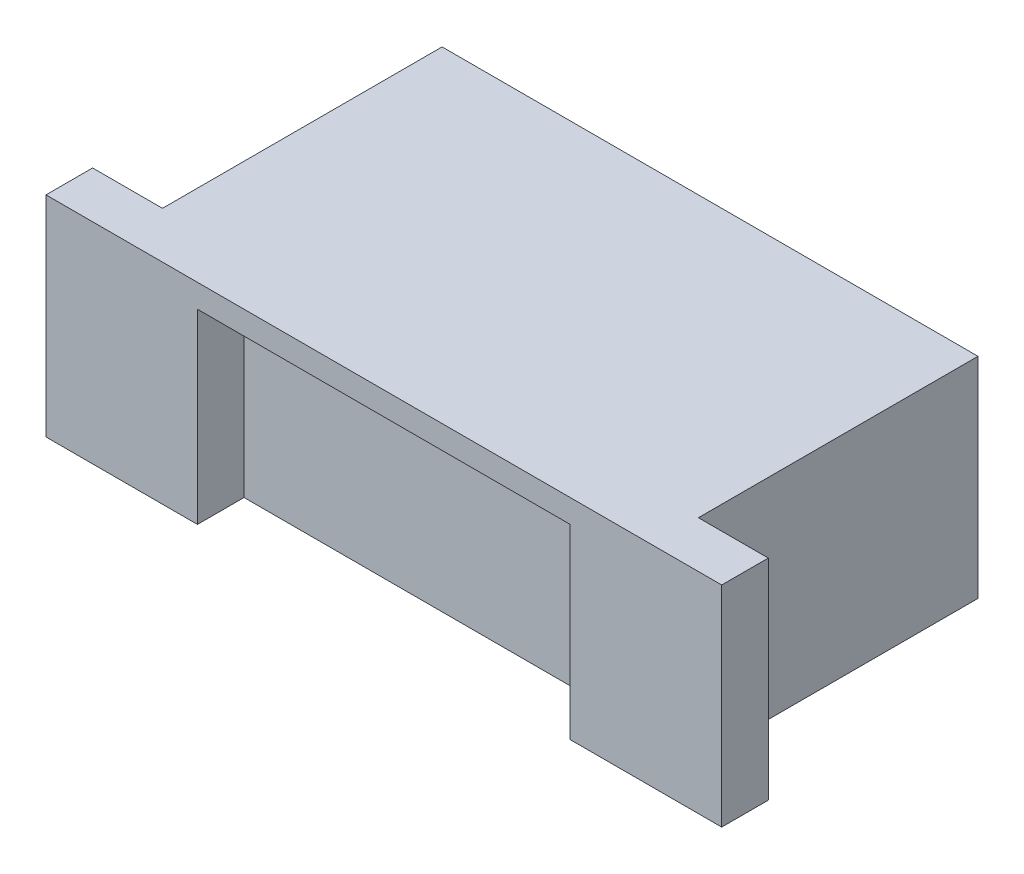
ISO-10303-21;
HEADER;
FILE_DESCRIPTION(('STEP AP214'),'2;1');
FILE_NAME('part.step','',(''),(''),'','','');
FILE_SCHEMA(('AUTOMOTIVE_DESIGN { 1 0 10303 214 1 1 1 1 }'));
ENDSEC;
DATA;
#1=APPLICATION_CONTEXT('core data for automotive mechanical design processes');
#2=APPLICATION_PROTOCOL_DEFINITION('international standard','automotive_design',2000,#1);
#3=PRODUCT_CONTEXT('',#1,'mechanical');
#4=PRODUCT('Part','Part','',(#3));
#5=PRODUCT_RELATED_PRODUCT_CATEGORY('part','',(#4));
#6=PRODUCT_DEFINITION_FORMATION('','',#4);
#7=PRODUCT_DEFINITION_CONTEXT('part definition',#1,'design');
#8=PRODUCT_DEFINITION('design','',#6,#7);
#9=PRODUCT_DEFINITION_SHAPE('','',#8);
#10=(LENGTH_UNIT() NAMED_UNIT(*) SI_UNIT(.MILLI.,.METRE.));
#11=(NAMED_UNIT(*) PLANE_ANGLE_UNIT() SI_UNIT($,.RADIAN.));
#12=(NAMED_UNIT(*) SI_UNIT($,.STERADIAN.) SOLID_ANGLE_UNIT());
#13=UNCERTAINTY_MEASURE_WITH_UNIT(LENGTH_MEASURE(1.E-05),#10,'distance_accuracy_value','');
#14=(GEOMETRIC_REPRESENTATION_CONTEXT(3) GLOBAL_UNCERTAINTY_ASSIGNED_CONTEXT((#13)) GLOBAL_UNIT_ASSIGNED_CONTEXT((#10,
#11,#12)) REPRESENTATION_CONTEXT('',''));
#15=CARTESIAN_POINT('',(0.,0.,0.));
#16=DIRECTION('',(0.,0.,1.));
#17=DIRECTION('',(1.,0.,0.));
#18=AXIS2_PLACEMENT_3D('',#15,#16,#17);
#19=CARTESIAN_POINT('',(0.,2.25,-0.5));
#20=DIRECTION('',(1.,0.,0.));
#21=DIRECTION('',(0.,0.,-1.));
#22=AXIS2_PLACEMENT_3D('',#19,#20,#21);
#23=PLANE('',#22);
#24=DIRECTION('',(0.,0.,1.));
#25=VECTOR('',#24,1.);
#26=CARTESIAN_POINT('',(0.,0.,-0.5));
#27=LINE('',#26,#25);
#28=CARTESIAN_POINT('',(0.,0.,-0.5));
#29=VERTEX_POINT('',#28);
#30=CARTESIAN_POINT('',(0.,0.,0.));
#31=VERTEX_POINT('',#30);
#32=EDGE_CURVE('E152',#29,#31,#27,.T.);
#33=ORIENTED_EDGE('',*,*,#32,.T.);
#34=DIRECTION('',(0.,-1.,0.));
#35=VECTOR('',#34,1.);
#36=CARTESIAN_POINT('',(0.,2.25,0.));
#37=LINE('',#36,#35);
#38=CARTESIAN_POINT('',(0.,2.25,0.));
#39=VERTEX_POINT('',#38);
#40=EDGE_CURVE('E11',#39,#31,#37,.T.);
#41=ORIENTED_EDGE('',*,*,#40,.F.);
#42=DIRECTION('',(0.,0.,1.));
#43=VECTOR('',#42,1.);
#44=CARTESIAN_POINT('',(0.,2.25,-0.5));
#45=LINE('',#44,#43);
#46=CARTESIAN_POINT('',(0.,2.25,-0.5));
#47=VERTEX_POINT('',#46);
#48=EDGE_CURVE('E178',#47,#39,#45,.T.);
#49=ORIENTED_EDGE('',*,*,#48,.F.);
#50=DIRECTION('',(0.,-1.,0.));
#51=VECTOR('',#50,1.);
#52=CARTESIAN_POINT('',(0.,2.25,-0.5));
#53=LINE('',#52,#51);
#54=EDGE_CURVE('E148',#47,#29,#53,.T.);
#55=ORIENTED_EDGE('',*,*,#54,.T.);
#56=EDGE_LOOP('',(#33,#41,#49,#55));
#57=FACE_BOUND('',#56,.T.);
#58=ADVANCED_FACE('F39',(#57),#23,.F.);
#59=CARTESIAN_POINT('',(0.,2.25,0.));
#60=DIRECTION('',(0.,0.,-1.));
#61=DIRECTION('',(-1.,0.,0.));
#62=AXIS2_PLACEMENT_3D('',#59,#60,#61);
#63=PLANE('',#62);
#64=DIRECTION('',(1.,0.,0.));
#65=VECTOR('',#64,1.);
#66=CARTESIAN_POINT('',(0.,0.,0.));
#67=LINE('',#66,#65);
#68=CARTESIAN_POINT('',(1.625,0.,0.));
#69=VERTEX_POINT('',#68);
#70=EDGE_CURVE('E158',#31,#69,#67,.T.);
#71=ORIENTED_EDGE('',*,*,#70,.T.);
#72=DIRECTION('',(0.,-1.,0.));
#73=VECTOR('',#72,1.);
#74=CARTESIAN_POINT('',(1.625,0.,0.));
#75=LINE('',#74,#73);
#76=CARTESIAN_POINT('',(1.625,2.,0.));
#77=VERTEX_POINT('',#76);
#78=EDGE_CURVE('E249',#77,#69,#75,.T.);
#79=ORIENTED_EDGE('',*,*,#78,.F.);
#80=DIRECTION('',(-1.,0.,0.));
#81=VECTOR('',#80,1.);
#82=CARTESIAN_POINT('',(1.625,2.,0.));
#83=LINE('',#82,#81);
#84=CARTESIAN_POINT('',(5.625,2.,0.));
#85=VERTEX_POINT('',#84);
#86=EDGE_CURVE('E241',#85,#77,#83,.T.);
#87=ORIENTED_EDGE('',*,*,#86,.F.);
#88=DIRECTION('',(0.,1.,0.));
#89=VECTOR('',#88,1.);
#90=CARTESIAN_POINT('',(5.625,0.,0.));
#91=LINE('',#90,#89);
#92=CARTESIAN_POINT('',(5.625,0.,0.));
#93=VERTEX_POINT('',#92);
#94=EDGE_CURVE('E245',#93,#85,#91,.T.);
#95=ORIENTED_EDGE('',*,*,#94,.F.);
#96=CARTESIAN_POINT('',(7.25,0.,0.));
#97=VERTEX_POINT('',#96);
#98=EDGE_CURVE('E156',#93,#97,#67,.T.);
#99=ORIENTED_EDGE('',*,*,#98,.T.);
#100=DIRECTION('',(0.,-1.,0.));
#101=VECTOR('',#100,1.);
#102=CARTESIAN_POINT('',(7.25,2.25,0.));
#103=LINE('',#102,#101);
#104=CARTESIAN_POINT('',(7.25,2.25,0.));
#105=VERTEX_POINT('',#104);
#106=EDGE_CURVE('E47',#105,#97,#103,.T.);
#107=ORIENTED_EDGE('',*,*,#106,.F.);
#108=DIRECTION('',(1.,0.,0.));
#109=VECTOR('',#108,1.);
#110=CARTESIAN_POINT('',(0.,2.25,0.));
#111=LINE('',#110,#109);
#112=EDGE_CURVE('E104',#39,#105,#111,.T.);
#113=ORIENTED_EDGE('',*,*,#112,.F.);
#114=ORIENTED_EDGE('',*,*,#40,.T.);
#115=EDGE_LOOP('',(#71,#79,#87,#95,#99,#107,#113,#114));
#116=FACE_BOUND('',#115,.T.);
#117=ADVANCED_FACE('F265',(#116),#63,.F.);
#118=CARTESIAN_POINT('',(7.25,2.25,0.));
#119=DIRECTION('',(-1.,0.,0.));
#120=DIRECTION('',(0.,0.,1.));
#121=AXIS2_PLACEMENT_3D('',#118,#119,#120);
#122=PLANE('',#121);
#123=DIRECTION('',(0.,0.,-1.));
#124=VECTOR('',#123,1.);
#125=CARTESIAN_POINT('',(7.25,0.,0.));
#126=LINE('',#125,#124);
#127=CARTESIAN_POINT('',(7.25,0.,-0.500000000000001));
#128=VERTEX_POINT('',#127);
#129=EDGE_CURVE('E162',#97,#128,#126,.T.);
#130=ORIENTED_EDGE('',*,*,#129,.T.);
#131=DIRECTION('',(0.,-1.,0.));
#132=VECTOR('',#131,1.);
#133=CARTESIAN_POINT('',(7.25,2.25,-0.500000000000001));
#134=LINE('',#133,#132);
#135=CARTESIAN_POINT('',(7.25,2.25,-0.500000000000001));
#136=VERTEX_POINT('',#135);
#137=EDGE_CURVE('E189',#136,#128,#134,.T.);
#138=ORIENTED_EDGE('',*,*,#137,.F.);
#139=DIRECTION('',(0.,0.,-1.));
#140=VECTOR('',#139,1.);
#141=CARTESIAN_POINT('',(7.25,2.25,0.));
#142=LINE('',#141,#140);
#143=EDGE_CURVE('E199',#105,#136,#142,.T.);
#144=ORIENTED_EDGE('',*,*,#143,.F.);
#145=ORIENTED_EDGE('',*,*,#106,.T.);
#146=EDGE_LOOP('',(#130,#138,#144,#145));
#147=FACE_BOUND('',#146,.T.);
#148=ADVANCED_FACE('F197',(#147),#122,.F.);
#149=CARTESIAN_POINT('',(7.25,2.25,-0.500000000000001));
#150=DIRECTION('',(0.,0.,1.));
#151=DIRECTION('',(1.,0.,0.));
#152=AXIS2_PLACEMENT_3D('',#149,#150,#151);
#153=PLANE('',#152);
#154=DIRECTION('',(-1.,0.,0.));
#155=VECTOR('',#154,1.);
#156=CARTESIAN_POINT('',(7.25,0.,-0.500000000000001));
#157=LINE('',#156,#155);
#158=CARTESIAN_POINT('',(6.5,0.,-0.500000000000002));
#159=VERTEX_POINT('',#158);
#160=EDGE_CURVE('E165',#128,#159,#157,.T.);
#161=ORIENTED_EDGE('',*,*,#160,.T.);
#162=DIRECTION('',(0.,-1.,0.));
#163=VECTOR('',#162,1.);
#164=CARTESIAN_POINT('',(6.5,2.25,-0.500000000000002));
#165=LINE('',#164,#163);
#166=CARTESIAN_POINT('',(6.5,2.25,-0.500000000000002));
#167=VERTEX_POINT('',#166);
#168=EDGE_CURVE('E185',#167,#159,#165,.T.);
#169=ORIENTED_EDGE('',*,*,#168,.F.);
#170=DIRECTION('',(-1.,0.,0.));
#171=VECTOR('',#170,1.);
#172=CARTESIAN_POINT('',(7.25,2.25,-0.500000000000001));
#173=LINE('',#172,#171);
#174=EDGE_CURVE('E215',#136,#167,#173,.T.);
#175=ORIENTED_EDGE('',*,*,#174,.F.);
#176=ORIENTED_EDGE('',*,*,#137,.T.);
#177=EDGE_LOOP('',(#161,#169,#175,#176));
#178=FACE_BOUND('',#177,.T.);
#179=ADVANCED_FACE('F210',(#178),#153,.F.);
#180=CARTESIAN_POINT('',(6.5,2.25,-0.500000000000002));
#181=DIRECTION('',(-1.,0.,0.));
#182=DIRECTION('',(0.,0.,1.));
#183=AXIS2_PLACEMENT_3D('',#180,#181,#182);
#184=PLANE('',#183);
#185=DIRECTION('',(0.,0.,-1.));
#186=VECTOR('',#185,1.);
#187=CARTESIAN_POINT('',(6.5,0.,-0.500000000000002));
#188=LINE('',#187,#186);
#189=CARTESIAN_POINT('',(6.5,0.,-3.5));
#190=VERTEX_POINT('',#189);
#191=EDGE_CURVE('E168',#159,#190,#188,.T.);
#192=ORIENTED_EDGE('',*,*,#191,.T.);
#193=DIRECTION('',(0.,-1.,0.));
#194=VECTOR('',#193,1.);
#195=CARTESIAN_POINT('',(6.5,2.25,-3.5));
#196=LINE('',#195,#194);
#197=CARTESIAN_POINT('',(6.5,2.25,-3.5));
#198=VERTEX_POINT('',#197);
#199=EDGE_CURVE('E141',#198,#190,#196,.T.);
#200=ORIENTED_EDGE('',*,*,#199,.F.);
#201=DIRECTION('',(0.,0.,-1.));
#202=VECTOR('',#201,1.);
#203=CARTESIAN_POINT('',(6.5,2.25,-0.500000000000002));
#204=LINE('',#203,#202);
#205=EDGE_CURVE('E127',#167,#198,#204,.T.);
#206=ORIENTED_EDGE('',*,*,#205,.F.);
#207=ORIENTED_EDGE('',*,*,#168,.T.);
#208=EDGE_LOOP('',(#192,#200,#206,#207));
#209=FACE_BOUND('',#208,.T.);
#210=ADVANCED_FACE('F213',(#209),#184,.F.);
#211=CARTESIAN_POINT('',(6.5,2.25,-3.5));
#212=DIRECTION('',(0.,0.,1.));
#213=DIRECTION('',(1.,0.,0.));
#214=AXIS2_PLACEMENT_3D('',#211,#212,#213);
#215=PLANE('',#214);
#216=DIRECTION('',(-1.,0.,0.));
#217=VECTOR('',#216,1.);
#218=CARTESIAN_POINT('',(6.5,0.,-3.5));
#219=LINE('',#218,#217);
#220=CARTESIAN_POINT('',(0.75,0.,-3.5));
#221=VERTEX_POINT('',#220);
#222=EDGE_CURVE('E137',#190,#221,#219,.T.);
#223=ORIENTED_EDGE('',*,*,#222,.T.);
#224=DIRECTION('',(0.,-1.,0.));
#225=VECTOR('',#224,1.);
#226=CARTESIAN_POINT('',(0.75,2.25,-3.5));
#227=LINE('',#226,#225);
#228=CARTESIAN_POINT('',(0.75,2.25,-3.5));
#229=VERTEX_POINT('',#228);
#230=EDGE_CURVE('E134',#229,#221,#227,.T.);
#231=ORIENTED_EDGE('',*,*,#230,.F.);
#232=DIRECTION('',(-1.,0.,0.));
#233=VECTOR('',#232,1.);
#234=CARTESIAN_POINT('',(6.5,2.25,-3.5));
#235=LINE('',#234,#233);
#236=EDGE_CURVE('E120',#198,#229,#235,.T.);
#237=ORIENTED_EDGE('',*,*,#236,.F.);
#238=ORIENTED_EDGE('',*,*,#199,.T.);
#239=EDGE_LOOP('',(#223,#231,#237,#238));
#240=FACE_BOUND('',#239,.T.);
#241=ADVANCED_FACE('F135',(#240),#215,.F.);
#242=CARTESIAN_POINT('',(0.75,2.25,-3.5));
#243=DIRECTION('',(1.,0.,0.));
#244=DIRECTION('',(0.,0.,-1.));
#245=AXIS2_PLACEMENT_3D('',#242,#243,#244);
#246=PLANE('',#245);
#247=DIRECTION('',(0.,0.,1.));
#248=VECTOR('',#247,1.);
#249=CARTESIAN_POINT('',(0.75,0.,-3.5));
#250=LINE('',#249,#248);
#251=CARTESIAN_POINT('',(0.75,0.,-0.5));
#252=VERTEX_POINT('',#251);
#253=EDGE_CURVE('E173',#221,#252,#250,.T.);
#254=ORIENTED_EDGE('',*,*,#253,.T.);
#255=DIRECTION('',(0.,-1.,0.));
#256=VECTOR('',#255,1.);
#257=CARTESIAN_POINT('',(0.75,2.25,-0.5));
#258=LINE('',#257,#256);
#259=CARTESIAN_POINT('',(0.75,2.25,-0.5));
#260=VERTEX_POINT('',#259);
#261=EDGE_CURVE('E142',#260,#252,#258,.T.);
#262=ORIENTED_EDGE('',*,*,#261,.F.);
#263=DIRECTION('',(0.,0.,1.));
#264=VECTOR('',#263,1.);
#265=CARTESIAN_POINT('',(0.75,2.25,-3.5));
#266=LINE('',#265,#264);
#267=EDGE_CURVE('E124',#229,#260,#266,.T.);
#268=ORIENTED_EDGE('',*,*,#267,.F.);
#269=ORIENTED_EDGE('',*,*,#230,.T.);
#270=EDGE_LOOP('',(#254,#262,#268,#269));
#271=FACE_BOUND('',#270,.T.);
#272=ADVANCED_FACE('F144',(#271),#246,.F.);
#273=CARTESIAN_POINT('',(0.75,2.25,-0.5));
#274=DIRECTION('',(0.,0.,1.));
#275=DIRECTION('',(1.,0.,0.));
#276=AXIS2_PLACEMENT_3D('',#273,#274,#275);
#277=PLANE('',#276);
#278=DIRECTION('',(-1.,0.,0.));
#279=VECTOR('',#278,1.);
#280=CARTESIAN_POINT('',(0.75,0.,-0.5));
#281=LINE('',#280,#279);
#282=EDGE_CURVE('E96',#252,#29,#281,.T.);
#283=ORIENTED_EDGE('',*,*,#282,.T.);
#284=ORIENTED_EDGE('',*,*,#54,.F.);
#285=DIRECTION('',(-1.,0.,0.));
#286=VECTOR('',#285,1.);
#287=CARTESIAN_POINT('',(0.75,2.25,-0.5));
#288=LINE('',#287,#286);
#289=EDGE_CURVE('E63',#260,#47,#288,.T.);
#290=ORIENTED_EDGE('',*,*,#289,.F.);
#291=ORIENTED_EDGE('',*,*,#261,.T.);
#292=EDGE_LOOP('',(#283,#284,#290,#291));
#293=FACE_BOUND('',#292,.T.);
#294=ADVANCED_FACE('F290',(#293),#277,.F.);
#295=CARTESIAN_POINT('',(0.,2.25,0.));
#296=DIRECTION('',(0.,1.,0.));
#297=DIRECTION('',(0.,0.,1.));
#298=AXIS2_PLACEMENT_3D('',#295,#296,#297);
#299=PLANE('',#298);
#300=ORIENTED_EDGE('',*,*,#48,.T.);
#301=ORIENTED_EDGE('',*,*,#112,.T.);
#302=ORIENTED_EDGE('',*,*,#143,.T.);
#303=ORIENTED_EDGE('',*,*,#174,.T.);
#304=ORIENTED_EDGE('',*,*,#205,.T.);
#305=ORIENTED_EDGE('',*,*,#236,.T.);
#306=ORIENTED_EDGE('',*,*,#267,.T.);
#307=ORIENTED_EDGE('',*,*,#289,.T.);
#308=EDGE_LOOP('',(#300,#301,#302,#303,#304,#305,#306,#307));
#309=FACE_BOUND('',#308,.T.);
#310=ADVANCED_FACE('F122',(#309),#299,.T.);
#311=CARTESIAN_POINT('',(0.,0.,0.));
#312=DIRECTION('',(0.,1.,0.));
#313=DIRECTION('',(0.,0.,1.));
#314=AXIS2_PLACEMENT_3D('',#311,#312,#313);
#315=PLANE('',#314);
#316=DIRECTION('',(1.,0.,0.));
#317=VECTOR('',#316,1.);
#318=CARTESIAN_POINT('',(1.625,0.,-0.5));
#319=LINE('',#318,#317);
#320=CARTESIAN_POINT('',(1.625,0.,-0.5));
#321=VERTEX_POINT('',#320);
#322=CARTESIAN_POINT('',(5.625,0.,-0.5));
#323=VERTEX_POINT('',#322);
#324=EDGE_CURVE('E259',#321,#323,#319,.T.);
#325=ORIENTED_EDGE('',*,*,#324,.F.);
#326=DIRECTION('',(0.,0.,1.));
#327=VECTOR('',#326,1.);
#328=CARTESIAN_POINT('',(1.625,0.,-0.5));
#329=LINE('',#328,#327);
#330=EDGE_CURVE('E225',#321,#69,#329,.T.);
#331=ORIENTED_EDGE('',*,*,#330,.T.);
#332=ORIENTED_EDGE('',*,*,#70,.F.);
#333=ORIENTED_EDGE('',*,*,#32,.F.);
#334=ORIENTED_EDGE('',*,*,#282,.F.);
#335=ORIENTED_EDGE('',*,*,#253,.F.);
#336=ORIENTED_EDGE('',*,*,#222,.F.);
#337=ORIENTED_EDGE('',*,*,#191,.F.);
#338=ORIENTED_EDGE('',*,*,#160,.F.);
#339=ORIENTED_EDGE('',*,*,#129,.F.);
#340=ORIENTED_EDGE('',*,*,#98,.F.);
#341=DIRECTION('',(0.,0.,1.));
#342=VECTOR('',#341,1.);
#343=CARTESIAN_POINT('',(5.625,0.,-0.5));
#344=LINE('',#343,#342);
#345=EDGE_CURVE('E229',#323,#93,#344,.T.);
#346=ORIENTED_EDGE('',*,*,#345,.F.);
#347=EDGE_LOOP('',(#325,#331,#332,#333,#334,#335,#336,#337,#338,#339,#340,#346));
#348=FACE_BOUND('',#347,.T.);
#349=ADVANCED_FACE('F204',(#348),#315,.F.);
#350=CARTESIAN_POINT('',(1.625,0.,-0.5));
#351=DIRECTION('',(-1.,0.,0.));
#352=DIRECTION('',(0.,-1.,0.));
#353=AXIS2_PLACEMENT_3D('',#350,#351,#352);
#354=PLANE('',#353);
#355=ORIENTED_EDGE('',*,*,#78,.T.);
#356=ORIENTED_EDGE('',*,*,#330,.F.);
#357=DIRECTION('',(0.,-1.,0.));
#358=VECTOR('',#357,1.);
#359=CARTESIAN_POINT('',(1.625,0.,-0.5));
#360=LINE('',#359,#358);
#361=CARTESIAN_POINT('',(1.625,2.,-0.5));
#362=VERTEX_POINT('',#361);
#363=EDGE_CURVE('E54',#362,#321,#360,.T.);
#364=ORIENTED_EDGE('',*,*,#363,.F.);
#365=DIRECTION('',(0.,0.,1.));
#366=VECTOR('',#365,1.);
#367=CARTESIAN_POINT('',(1.625,2.,-0.5));
#368=LINE('',#367,#366);
#369=EDGE_CURVE('E157',#362,#77,#368,.T.);
#370=ORIENTED_EDGE('',*,*,#369,.T.);
#371=EDGE_LOOP('',(#355,#356,#364,#370));
#372=FACE_BOUND('',#371,.T.);
#373=ADVANCED_FACE('F347',(#372),#354,.F.);
#374=CARTESIAN_POINT('',(1.625,2.,-0.5));
#375=DIRECTION('',(0.,1.,0.));
#376=DIRECTION('',(0.,0.,1.));
#377=AXIS2_PLACEMENT_3D('',#374,#375,#376);
#378=PLANE('',#377);
#379=ORIENTED_EDGE('',*,*,#86,.T.);
#380=ORIENTED_EDGE('',*,*,#369,.F.);
#381=DIRECTION('',(-1.,0.,0.));
#382=VECTOR('',#381,1.);
#383=CARTESIAN_POINT('',(1.625,2.,-0.5));
#384=LINE('',#383,#382);
#385=CARTESIAN_POINT('',(5.625,2.,-0.5));
#386=VERTEX_POINT('',#385);
#387=EDGE_CURVE('E230',#386,#362,#384,.T.);
#388=ORIENTED_EDGE('',*,*,#387,.F.);
#389=DIRECTION('',(0.,0.,1.));
#390=VECTOR('',#389,1.);
#391=CARTESIAN_POINT('',(5.625,2.,-0.5));
#392=LINE('',#391,#390);
#393=EDGE_CURVE('E234',#386,#85,#392,.T.);
#394=ORIENTED_EDGE('',*,*,#393,.T.);
#395=EDGE_LOOP('',(#379,#380,#388,#394));
#396=FACE_BOUND('',#395,.T.);
#397=ADVANCED_FACE('F355',(#396),#378,.F.);
#398=CARTESIAN_POINT('',(5.625,0.,-0.5));
#399=DIRECTION('',(1.,0.,0.));
#400=DIRECTION('',(0.,0.,-1.));
#401=AXIS2_PLACEMENT_3D('',#398,#399,#400);
#402=PLANE('',#401);
#403=ORIENTED_EDGE('',*,*,#94,.T.);
#404=ORIENTED_EDGE('',*,*,#393,.F.);
#405=DIRECTION('',(0.,1.,0.));
#406=VECTOR('',#405,1.);
#407=CARTESIAN_POINT('',(5.625,0.,-0.5));
#408=LINE('',#407,#406);
#409=EDGE_CURVE('E255',#323,#386,#408,.T.);
#410=ORIENTED_EDGE('',*,*,#409,.F.);
#411=ORIENTED_EDGE('',*,*,#345,.T.);
#412=EDGE_LOOP('',(#403,#404,#410,#411));
#413=FACE_BOUND('',#412,.T.);
#414=ADVANCED_FACE('F273',(#413),#402,.F.);
#415=CARTESIAN_POINT('',(0.,0.,-0.5));
#416=DIRECTION('',(0.,0.,-1.));
#417=DIRECTION('',(-1.,0.,0.));
#418=AXIS2_PLACEMENT_3D('',#415,#416,#417);
#419=PLANE('',#418);
#420=ORIENTED_EDGE('',*,*,#363,.T.);
#421=ORIENTED_EDGE('',*,*,#324,.T.);
#422=ORIENTED_EDGE('',*,*,#409,.T.);
#423=ORIENTED_EDGE('',*,*,#387,.T.);
#424=EDGE_LOOP('',(#420,#421,#422,#423));
#425=FACE_BOUND('',#424,.T.);
#426=ADVANCED_FACE('F284',(#425),#419,.F.);
#427=CLOSED_SHELL('',(#58,#117,#148,#179,#210,#241,#272,#294,#310,#349,#373,#397,#414,#426));
#428=MANIFOLD_SOLID_BREP('B2',#427);
#429=ADVANCED_BREP_SHAPE_REPRESENTATION('',(#18,#428),#14);
#430=SHAPE_DEFINITION_REPRESENTATION(#9,#429);
ENDSEC;
END-ISO-10303-21;
